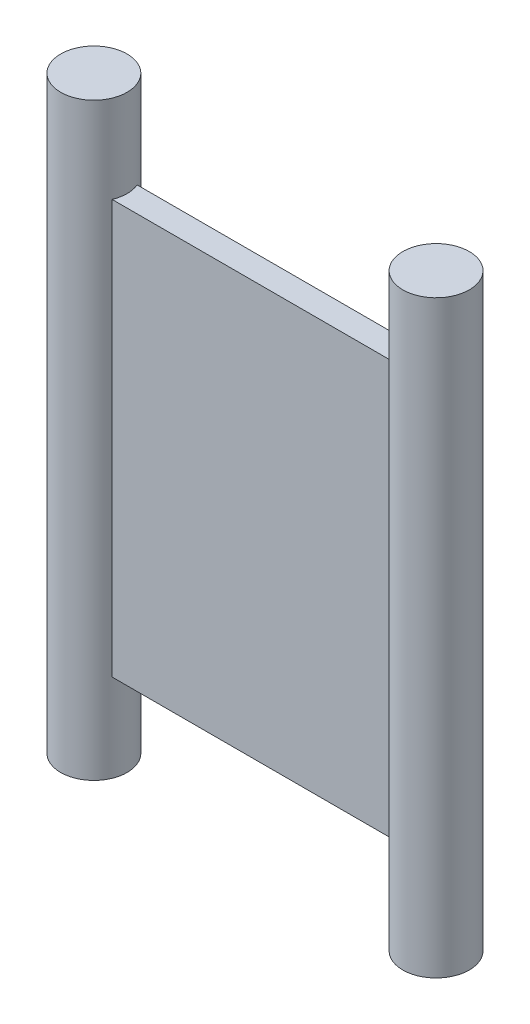
ISO-10303-21;
HEADER;
FILE_DESCRIPTION(('STEP AP214'),'2;1');
FILE_NAME('part.step','',(''),(''),'','','');
FILE_SCHEMA(('AUTOMOTIVE_DESIGN { 1 0 10303 214 1 1 1 1 }'));
ENDSEC;
DATA;
#1=APPLICATION_CONTEXT('core data for automotive mechanical design processes');
#2=APPLICATION_PROTOCOL_DEFINITION('international standard','automotive_design',2000,#1);
#3=PRODUCT_CONTEXT('',#1,'mechanical');
#4=PRODUCT('Part','Part','',(#3));
#5=PRODUCT_RELATED_PRODUCT_CATEGORY('part','',(#4));
#6=PRODUCT_DEFINITION_FORMATION('','',#4);
#7=PRODUCT_DEFINITION_CONTEXT('part definition',#1,'design');
#8=PRODUCT_DEFINITION('design','',#6,#7);
#9=PRODUCT_DEFINITION_SHAPE('','',#8);
#10=(LENGTH_UNIT() NAMED_UNIT(*) SI_UNIT(.MILLI.,.METRE.));
#11=(NAMED_UNIT(*) PLANE_ANGLE_UNIT() SI_UNIT($,.RADIAN.));
#12=(NAMED_UNIT(*) SI_UNIT($,.STERADIAN.) SOLID_ANGLE_UNIT());
#13=UNCERTAINTY_MEASURE_WITH_UNIT(LENGTH_MEASURE(1.E-05),#10,'distance_accuracy_value','');
#14=(GEOMETRIC_REPRESENTATION_CONTEXT(3) GLOBAL_UNCERTAINTY_ASSIGNED_CONTEXT((#13)) GLOBAL_UNIT_ASSIGNED_CONTEXT((#10,
#11,#12)) REPRESENTATION_CONTEXT('',''));
#15=CARTESIAN_POINT('',(0.,0.,0.));
#16=DIRECTION('',(0.,0.,1.));
#17=DIRECTION('',(1.,0.,0.));
#18=AXIS2_PLACEMENT_3D('',#15,#16,#17);
#19=CARTESIAN_POINT('',(6.825,16.5,0.499999999999999));
#20=DIRECTION('',(0.,0.,-1.));
#21=DIRECTION('',(-1.,0.,0.));
#22=AXIS2_PLACEMENT_3D('',#19,#20,#21);
#23=PLANE('',#22);
#24=DIRECTION('',(0.,-1.,0.));
#25=VECTOR('',#24,1.);
#26=CARTESIAN_POINT('',(5.5979608808192,20.,0.499999999999999));
#27=LINE('',#26,#25);
#28=CARTESIAN_POINT('',(5.5979608808192,16.5,0.499999999999999));
#29=VERTEX_POINT('',#28);
#30=CARTESIAN_POINT('',(5.5979608808192,0.,0.499999999999999));
#31=VERTEX_POINT('',#30);
#32=EDGE_CURVE('E53',#29,#31,#27,.T.);
#33=ORIENTED_EDGE('',*,*,#32,.F.);
#34=DIRECTION('',(1.,0.,0.));
#35=VECTOR('',#34,1.);
#36=CARTESIAN_POINT('',(6.825,16.5,0.499999999999999));
#37=LINE('',#36,#35);
#38=CARTESIAN_POINT('',(-5.5979608808192,16.5,0.500000000000001));
#39=VERTEX_POINT('',#38);
#40=EDGE_CURVE('E90',#39,#29,#37,.T.);
#41=ORIENTED_EDGE('',*,*,#40,.F.);
#42=DIRECTION('',(0.,-1.,0.));
#43=VECTOR('',#42,1.);
#44=CARTESIAN_POINT('',(-5.5979608808192,20.,0.500000000000001));
#45=LINE('',#44,#43);
#46=CARTESIAN_POINT('',(-5.5979608808192,0.,0.500000000000001));
#47=VERTEX_POINT('',#46);
#48=EDGE_CURVE('E103',#47,#39,#45,.F.);
#49=ORIENTED_EDGE('',*,*,#48,.F.);
#50=DIRECTION('',(1.,0.,0.));
#51=VECTOR('',#50,1.);
#52=CARTESIAN_POINT('',(6.825,0.,0.499999999999999));
#53=LINE('',#52,#51);
#54=EDGE_CURVE('E91',#47,#31,#53,.T.);
#55=ORIENTED_EDGE('',*,*,#54,.T.);
#56=EDGE_LOOP('',(#33,#41,#49,#55));
#57=FACE_BOUND('',#56,.T.);
#58=ADVANCED_FACE('F39',(#57),#23,.F.);
#59=CARTESIAN_POINT('',(6.825,16.5,-0.500000000000001));
#60=DIRECTION('',(0.,0.,1.));
#61=DIRECTION('',(1.,0.,0.));
#62=AXIS2_PLACEMENT_3D('',#59,#60,#61);
#63=PLANE('',#62);
#64=DIRECTION('',(0.,-1.,0.));
#65=VECTOR('',#64,1.);
#66=CARTESIAN_POINT('',(5.5979608808192,20.,-0.500000000000001));
#67=LINE('',#66,#65);
#68=CARTESIAN_POINT('',(5.5979608808192,0.,-0.500000000000001));
#69=VERTEX_POINT('',#68);
#70=CARTESIAN_POINT('',(5.5979608808192,16.5,-0.500000000000001));
#71=VERTEX_POINT('',#70);
#72=EDGE_CURVE('E78',#69,#71,#67,.F.);
#73=ORIENTED_EDGE('',*,*,#72,.F.);
#74=DIRECTION('',(-1.,0.,0.));
#75=VECTOR('',#74,1.);
#76=CARTESIAN_POINT('',(6.825,0.,-0.500000000000001));
#77=LINE('',#76,#75);
#78=CARTESIAN_POINT('',(-5.5979608808192,0.,-0.499999999999999));
#79=VERTEX_POINT('',#78);
#80=EDGE_CURVE('E60',#69,#79,#77,.T.);
#81=ORIENTED_EDGE('',*,*,#80,.T.);
#82=DIRECTION('',(0.,-1.,0.));
#83=VECTOR('',#82,1.);
#84=CARTESIAN_POINT('',(-5.5979608808192,20.,-0.499999999999999));
#85=LINE('',#84,#83);
#86=CARTESIAN_POINT('',(-5.5979608808192,16.5,-0.499999999999999));
#87=VERTEX_POINT('',#86);
#88=EDGE_CURVE('E105',#87,#79,#85,.T.);
#89=ORIENTED_EDGE('',*,*,#88,.F.);
#90=DIRECTION('',(-1.,0.,0.));
#91=VECTOR('',#90,1.);
#92=CARTESIAN_POINT('',(6.825,16.5,-0.500000000000001));
#93=LINE('',#92,#91);
#94=EDGE_CURVE('E85',#71,#87,#93,.T.);
#95=ORIENTED_EDGE('',*,*,#94,.F.);
#96=EDGE_LOOP('',(#73,#81,#89,#95));
#97=FACE_BOUND('',#96,.T.);
#98=ADVANCED_FACE('F84',(#97),#63,.F.);
#99=CARTESIAN_POINT('',(-6.825,20.,0.));
#100=DIRECTION('',(0.,-1.,0.));
#101=DIRECTION('',(0.,0.,-1.));
#102=AXIS2_PLACEMENT_3D('',#99,#100,#101);
#103=CYLINDRICAL_SURFACE('',#102,1.325);
#104=CARTESIAN_POINT('',(-6.825,20.,0.));
#105=DIRECTION('',(0.,1.,0.));
#106=DIRECTION('',(0.,0.,1.));
#107=AXIS2_PLACEMENT_3D('',#104,#105,#106);
#108=CIRCLE('',#107,1.325);
#109=CARTESIAN_POINT('',(-6.825,20.,1.325));
#110=VERTEX_POINT('',#109);
#111=EDGE_CURVE('E107',#110,#110,#108,.T.);
#112=ORIENTED_EDGE('',*,*,#111,.F.);
#113=EDGE_LOOP('',(#112));
#114=FACE_BOUND('',#113,.T.);
#115=CARTESIAN_POINT('',(-6.825,-3.5,0.));
#116=DIRECTION('',(0.,1.,0.));
#117=DIRECTION('',(0.,0.,1.));
#118=AXIS2_PLACEMENT_3D('',#115,#116,#117);
#119=CIRCLE('',#118,1.325);
#120=CARTESIAN_POINT('',(-6.825,-3.5,1.325));
#121=VERTEX_POINT('',#120);
#122=EDGE_CURVE('E108',#121,#121,#119,.T.);
#123=ORIENTED_EDGE('',*,*,#122,.T.);
#124=EDGE_LOOP('',(#123));
#125=FACE_BOUND('',#124,.T.);
#126=ORIENTED_EDGE('',*,*,#48,.T.);
#127=CARTESIAN_POINT('',(-6.825,16.5,0.));
#128=DIRECTION('',(0.,-1.,0.));
#129=DIRECTION('',(0.,0.,-1.));
#130=AXIS2_PLACEMENT_3D('',#127,#128,#129);
#131=CIRCLE('',#130,1.325);
#132=EDGE_CURVE('E95',#39,#87,#131,.F.);
#133=ORIENTED_EDGE('',*,*,#132,.T.);
#134=ORIENTED_EDGE('',*,*,#88,.T.);
#135=CARTESIAN_POINT('',(-6.825,0.,0.));
#136=DIRECTION('',(0.,-1.,0.));
#137=DIRECTION('',(0.,0.,-1.));
#138=AXIS2_PLACEMENT_3D('',#135,#136,#137);
#139=CIRCLE('',#138,1.325);
#140=EDGE_CURVE('E46',#47,#79,#139,.F.);
#141=ORIENTED_EDGE('',*,*,#140,.F.);
#142=EDGE_LOOP('',(#126,#133,#134,#141));
#143=FACE_BOUND('',#142,.T.);
#144=ADVANCED_FACE('F138',(#114,#125,#143),#103,.T.);
#145=CARTESIAN_POINT('',(-6.825,20.,0.));
#146=DIRECTION('',(0.,1.,0.));
#147=DIRECTION('',(0.,0.,1.));
#148=AXIS2_PLACEMENT_3D('',#145,#146,#147);
#149=PLANE('',#148);
#150=ORIENTED_EDGE('',*,*,#111,.T.);
#151=EDGE_LOOP('',(#150));
#152=FACE_BOUND('',#151,.T.);
#153=ADVANCED_FACE('F144',(#152),#149,.T.);
#154=CARTESIAN_POINT('',(-6.825,-3.5,0.));
#155=DIRECTION('',(0.,1.,0.));
#156=DIRECTION('',(0.,0.,1.));
#157=AXIS2_PLACEMENT_3D('',#154,#155,#156);
#158=PLANE('',#157);
#159=ORIENTED_EDGE('',*,*,#122,.F.);
#160=EDGE_LOOP('',(#159));
#161=FACE_BOUND('',#160,.T.);
#162=ADVANCED_FACE('F150',(#161),#158,.F.);
#163=CARTESIAN_POINT('',(0.,16.5,0.));
#164=DIRECTION('',(0.,-1.,0.));
#165=DIRECTION('',(0.,0.,-1.));
#166=AXIS2_PLACEMENT_3D('',#163,#164,#165);
#167=PLANE('',#166);
#168=CARTESIAN_POINT('',(6.825,16.5,0.));
#169=DIRECTION('',(0.,-1.,0.));
#170=DIRECTION('',(0.,0.,-1.));
#171=AXIS2_PLACEMENT_3D('',#168,#169,#170);
#172=CIRCLE('',#171,1.325);
#173=EDGE_CURVE('E111',#71,#29,#172,.F.);
#174=ORIENTED_EDGE('',*,*,#173,.F.);
#175=ORIENTED_EDGE('',*,*,#94,.T.);
#176=ORIENTED_EDGE('',*,*,#132,.F.);
#177=ORIENTED_EDGE('',*,*,#40,.T.);
#178=EDGE_LOOP('',(#174,#175,#176,#177));
#179=FACE_BOUND('',#178,.T.);
#180=ADVANCED_FACE('F141',(#179),#167,.F.);
#181=CARTESIAN_POINT('',(0.,0.,0.));
#182=DIRECTION('',(0.,-1.,0.));
#183=DIRECTION('',(0.,0.,-1.));
#184=AXIS2_PLACEMENT_3D('',#181,#182,#183);
#185=PLANE('',#184);
#186=ORIENTED_EDGE('',*,*,#80,.F.);
#187=CARTESIAN_POINT('',(6.825,0.,0.));
#188=DIRECTION('',(0.,-1.,0.));
#189=DIRECTION('',(0.,0.,-1.));
#190=AXIS2_PLACEMENT_3D('',#187,#188,#189);
#191=CIRCLE('',#190,1.325);
#192=EDGE_CURVE('E11',#69,#31,#191,.F.);
#193=ORIENTED_EDGE('',*,*,#192,.T.);
#194=ORIENTED_EDGE('',*,*,#54,.F.);
#195=ORIENTED_EDGE('',*,*,#140,.T.);
#196=EDGE_LOOP('',(#186,#193,#194,#195));
#197=FACE_BOUND('',#196,.T.);
#198=ADVANCED_FACE('F89',(#197),#185,.T.);
#199=CARTESIAN_POINT('',(6.825,20.,0.));
#200=DIRECTION('',(0.,-1.,0.));
#201=DIRECTION('',(0.,0.,-1.));
#202=AXIS2_PLACEMENT_3D('',#199,#200,#201);
#203=CYLINDRICAL_SURFACE('',#202,1.325);
#204=CARTESIAN_POINT('',(6.825,20.,0.));
#205=DIRECTION('',(0.,1.,0.));
#206=DIRECTION('',(0.,0.,1.));
#207=AXIS2_PLACEMENT_3D('',#204,#205,#206);
#208=CIRCLE('',#207,1.325);
#209=CARTESIAN_POINT('',(6.825,20.,1.325));
#210=VERTEX_POINT('',#209);
#211=EDGE_CURVE('E116',#210,#210,#208,.T.);
#212=ORIENTED_EDGE('',*,*,#211,.F.);
#213=EDGE_LOOP('',(#212));
#214=FACE_BOUND('',#213,.T.);
#215=CARTESIAN_POINT('',(6.825,-3.5,0.));
#216=DIRECTION('',(0.,1.,0.));
#217=DIRECTION('',(0.,0.,1.));
#218=AXIS2_PLACEMENT_3D('',#215,#216,#217);
#219=CIRCLE('',#218,1.325);
#220=CARTESIAN_POINT('',(6.825,-3.5,1.325));
#221=VERTEX_POINT('',#220);
#222=EDGE_CURVE('E86',#221,#221,#219,.T.);
#223=ORIENTED_EDGE('',*,*,#222,.T.);
#224=EDGE_LOOP('',(#223));
#225=FACE_BOUND('',#224,.T.);
#226=ORIENTED_EDGE('',*,*,#72,.T.);
#227=ORIENTED_EDGE('',*,*,#173,.T.);
#228=ORIENTED_EDGE('',*,*,#32,.T.);
#229=ORIENTED_EDGE('',*,*,#192,.F.);
#230=EDGE_LOOP('',(#226,#227,#228,#229));
#231=FACE_BOUND('',#230,.T.);
#232=ADVANCED_FACE('F77',(#214,#225,#231),#203,.T.);
#233=CARTESIAN_POINT('',(6.825,20.,0.));
#234=DIRECTION('',(0.,1.,0.));
#235=DIRECTION('',(0.,0.,1.));
#236=AXIS2_PLACEMENT_3D('',#233,#234,#235);
#237=PLANE('',#236);
#238=ORIENTED_EDGE('',*,*,#211,.T.);
#239=EDGE_LOOP('',(#238));
#240=FACE_BOUND('',#239,.T.);
#241=ADVANCED_FACE('F125',(#240),#237,.T.);
#242=CARTESIAN_POINT('',(6.825,-3.5,0.));
#243=DIRECTION('',(0.,1.,0.));
#244=DIRECTION('',(0.,0.,1.));
#245=AXIS2_PLACEMENT_3D('',#242,#243,#244);
#246=PLANE('',#245);
#247=ORIENTED_EDGE('',*,*,#222,.F.);
#248=EDGE_LOOP('',(#247));
#249=FACE_BOUND('',#248,.T.);
#250=ADVANCED_FACE('F123',(#249),#246,.F.);
#251=CLOSED_SHELL('',(#58,#98,#144,#153,#162,#180,#198,#232,#241,#250));
#252=MANIFOLD_SOLID_BREP('B2',#251);
#253=ADVANCED_BREP_SHAPE_REPRESENTATION('',(#18,#252),#14);
#254=SHAPE_DEFINITION_REPRESENTATION(#9,#253);
ENDSEC;
END-ISO-10303-21;
